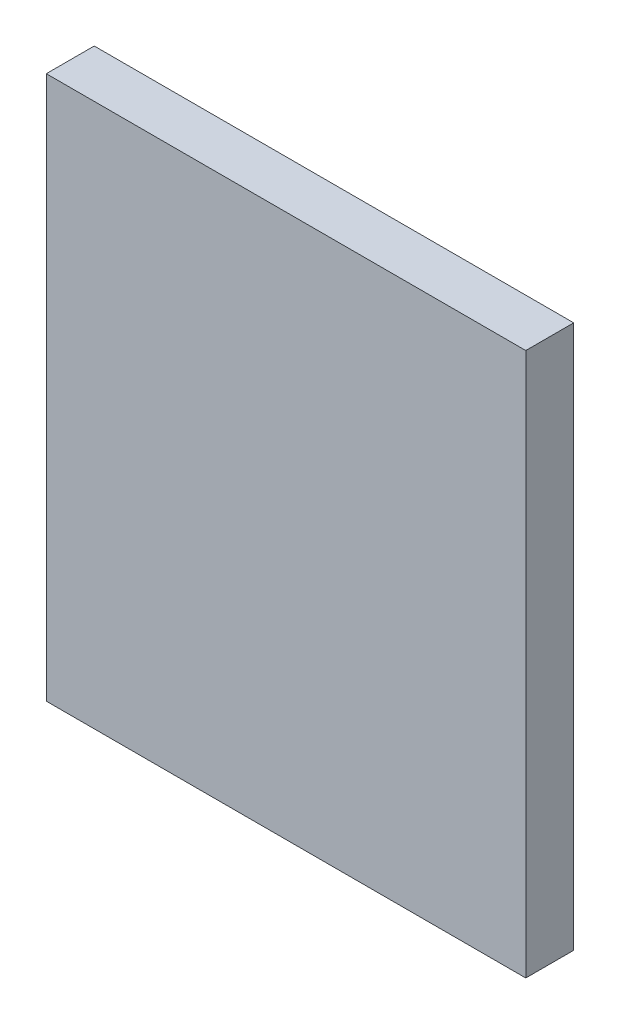
ISO-10303-21;
HEADER;
FILE_DESCRIPTION(('STEP AP214'),'2;1');
FILE_NAME('part.step','',(''),(''),'','','');
FILE_SCHEMA(('AUTOMOTIVE_DESIGN { 1 0 10303 214 1 1 1 1 }'));
ENDSEC;
DATA;
#1=APPLICATION_CONTEXT('core data for automotive mechanical design processes');
#2=APPLICATION_PROTOCOL_DEFINITION('international standard','automotive_design',2000,#1);
#3=PRODUCT_CONTEXT('',#1,'mechanical');
#4=PRODUCT('Part','Part','',(#3));
#5=PRODUCT_RELATED_PRODUCT_CATEGORY('part','',(#4));
#6=PRODUCT_DEFINITION_FORMATION('','',#4);
#7=PRODUCT_DEFINITION_CONTEXT('part definition',#1,'design');
#8=PRODUCT_DEFINITION('design','',#6,#7);
#9=PRODUCT_DEFINITION_SHAPE('','',#8);
#10=(LENGTH_UNIT() NAMED_UNIT(*) SI_UNIT(.MILLI.,.METRE.));
#11=(NAMED_UNIT(*) PLANE_ANGLE_UNIT() SI_UNIT($,.RADIAN.));
#12=(NAMED_UNIT(*) SI_UNIT($,.STERADIAN.) SOLID_ANGLE_UNIT());
#13=UNCERTAINTY_MEASURE_WITH_UNIT(LENGTH_MEASURE(1.E-05),#10,'distance_accuracy_value','');
#14=(GEOMETRIC_REPRESENTATION_CONTEXT(3) GLOBAL_UNCERTAINTY_ASSIGNED_CONTEXT((#13)) GLOBAL_UNIT_ASSIGNED_CONTEXT((#10,
#11,#12)) REPRESENTATION_CONTEXT('',''));
#15=CARTESIAN_POINT('',(0.,0.,0.));
#16=DIRECTION('',(0.,0.,1.));
#17=DIRECTION('',(1.,0.,0.));
#18=AXIS2_PLACEMENT_3D('',#15,#16,#17);
#19=CARTESIAN_POINT('',(75.,85.,15.));
#20=DIRECTION('',(-1.,0.,0.));
#21=DIRECTION('',(0.,-1.,0.));
#22=AXIS2_PLACEMENT_3D('',#19,#20,#21);
#23=PLANE('',#22);
#24=DIRECTION('',(0.,1.,0.));
#25=VECTOR('',#24,1.);
#26=CARTESIAN_POINT('',(75.,85.,0.));
#27=LINE('',#26,#25);
#28=CARTESIAN_POINT('',(75.,-85.,0.));
#29=VERTEX_POINT('',#28);
#30=CARTESIAN_POINT('',(75.,85.,0.));
#31=VERTEX_POINT('',#30);
#32=EDGE_CURVE('E96',#29,#31,#27,.T.);
#33=ORIENTED_EDGE('',*,*,#32,.T.);
#34=DIRECTION('',(0.,0.,-1.));
#35=VECTOR('',#34,1.);
#36=CARTESIAN_POINT('',(75.,85.,15.));
#37=LINE('',#36,#35);
#38=CARTESIAN_POINT('',(75.,85.,15.));
#39=VERTEX_POINT('',#38);
#40=EDGE_CURVE('E11',#39,#31,#37,.T.);
#41=ORIENTED_EDGE('',*,*,#40,.F.);
#42=DIRECTION('',(0.,1.,0.));
#43=VECTOR('',#42,1.);
#44=CARTESIAN_POINT('',(75.,85.,15.));
#45=LINE('',#44,#43);
#46=CARTESIAN_POINT('',(75.,-85.,15.));
#47=VERTEX_POINT('',#46);
#48=EDGE_CURVE('E84',#47,#39,#45,.T.);
#49=ORIENTED_EDGE('',*,*,#48,.F.);
#50=DIRECTION('',(0.,0.,-1.));
#51=VECTOR('',#50,1.);
#52=CARTESIAN_POINT('',(75.,-85.,15.));
#53=LINE('',#52,#51);
#54=EDGE_CURVE('E92',#47,#29,#53,.T.);
#55=ORIENTED_EDGE('',*,*,#54,.T.);
#56=EDGE_LOOP('',(#33,#41,#49,#55));
#57=FACE_BOUND('',#56,.T.);
#58=ADVANCED_FACE('F33',(#57),#23,.F.);
#59=CARTESIAN_POINT('',(-75.,85.,15.));
#60=DIRECTION('',(0.,-1.,0.));
#61=DIRECTION('',(0.,0.,-1.));
#62=AXIS2_PLACEMENT_3D('',#59,#60,#61);
#63=PLANE('',#62);
#64=DIRECTION('',(-1.,0.,0.));
#65=VECTOR('',#64,1.);
#66=CARTESIAN_POINT('',(-75.,85.,0.));
#67=LINE('',#66,#65);
#68=CARTESIAN_POINT('',(-75.,85.,0.));
#69=VERTEX_POINT('',#68);
#70=EDGE_CURVE('E88',#31,#69,#67,.T.);
#71=ORIENTED_EDGE('',*,*,#70,.T.);
#72=DIRECTION('',(0.,0.,-1.));
#73=VECTOR('',#72,1.);
#74=CARTESIAN_POINT('',(-75.,85.,15.));
#75=LINE('',#74,#73);
#76=CARTESIAN_POINT('',(-75.,85.,15.));
#77=VERTEX_POINT('',#76);
#78=EDGE_CURVE('E41',#77,#69,#75,.T.);
#79=ORIENTED_EDGE('',*,*,#78,.F.);
#80=DIRECTION('',(-1.,0.,0.));
#81=VECTOR('',#80,1.);
#82=CARTESIAN_POINT('',(-75.,85.,15.));
#83=LINE('',#82,#81);
#84=EDGE_CURVE('E79',#39,#77,#83,.T.);
#85=ORIENTED_EDGE('',*,*,#84,.F.);
#86=ORIENTED_EDGE('',*,*,#40,.T.);
#87=EDGE_LOOP('',(#71,#79,#85,#86));
#88=FACE_BOUND('',#87,.T.);
#89=ADVANCED_FACE('F87',(#88),#63,.F.);
#90=CARTESIAN_POINT('',(-75.,85.,15.));
#91=DIRECTION('',(1.,0.,0.));
#92=DIRECTION('',(0.,1.,0.));
#93=AXIS2_PLACEMENT_3D('',#90,#91,#92);
#94=PLANE('',#93);
#95=DIRECTION('',(0.,-1.,0.));
#96=VECTOR('',#95,1.);
#97=CARTESIAN_POINT('',(-75.,85.,0.));
#98=LINE('',#97,#96);
#99=CARTESIAN_POINT('',(-75.,-85.,0.));
#100=VERTEX_POINT('',#99);
#101=EDGE_CURVE('E66',#69,#100,#98,.T.);
#102=ORIENTED_EDGE('',*,*,#101,.T.);
#103=DIRECTION('',(0.,0.,-1.));
#104=VECTOR('',#103,1.);
#105=CARTESIAN_POINT('',(-75.,-85.,15.));
#106=LINE('',#105,#104);
#107=CARTESIAN_POINT('',(-75.,-85.,15.));
#108=VERTEX_POINT('',#107);
#109=EDGE_CURVE('E89',#108,#100,#106,.T.);
#110=ORIENTED_EDGE('',*,*,#109,.F.);
#111=DIRECTION('',(0.,-1.,0.));
#112=VECTOR('',#111,1.);
#113=CARTESIAN_POINT('',(-75.,85.,15.));
#114=LINE('',#113,#112);
#115=EDGE_CURVE('E82',#77,#108,#114,.T.);
#116=ORIENTED_EDGE('',*,*,#115,.F.);
#117=ORIENTED_EDGE('',*,*,#78,.T.);
#118=EDGE_LOOP('',(#102,#110,#116,#117));
#119=FACE_BOUND('',#118,.T.);
#120=ADVANCED_FACE('F90',(#119),#94,.F.);
#121=CARTESIAN_POINT('',(-75.,-85.,15.));
#122=DIRECTION('',(0.,1.,0.));
#123=DIRECTION('',(0.,0.,1.));
#124=AXIS2_PLACEMENT_3D('',#121,#122,#123);
#125=PLANE('',#124);
#126=DIRECTION('',(1.,0.,0.));
#127=VECTOR('',#126,1.);
#128=CARTESIAN_POINT('',(-75.,-85.,0.));
#129=LINE('',#128,#127);
#130=EDGE_CURVE('E72',#100,#29,#129,.T.);
#131=ORIENTED_EDGE('',*,*,#130,.T.);
#132=ORIENTED_EDGE('',*,*,#54,.F.);
#133=DIRECTION('',(1.,0.,0.));
#134=VECTOR('',#133,1.);
#135=CARTESIAN_POINT('',(-75.,-85.,15.));
#136=LINE('',#135,#134);
#137=EDGE_CURVE('E49',#108,#47,#136,.T.);
#138=ORIENTED_EDGE('',*,*,#137,.F.);
#139=ORIENTED_EDGE('',*,*,#109,.T.);
#140=EDGE_LOOP('',(#131,#132,#138,#139));
#141=FACE_BOUND('',#140,.T.);
#142=ADVANCED_FACE('F103',(#141),#125,.F.);
#143=CARTESIAN_POINT('',(0.,0.,15.));
#144=DIRECTION('',(0.,0.,1.));
#145=DIRECTION('',(1.,0.,0.));
#146=AXIS2_PLACEMENT_3D('',#143,#144,#145);
#147=PLANE('',#146);
#148=ORIENTED_EDGE('',*,*,#48,.T.);
#149=ORIENTED_EDGE('',*,*,#84,.T.);
#150=ORIENTED_EDGE('',*,*,#115,.T.);
#151=ORIENTED_EDGE('',*,*,#137,.T.);
#152=EDGE_LOOP('',(#148,#149,#150,#151));
#153=FACE_BOUND('',#152,.T.);
#154=ADVANCED_FACE('F80',(#153),#147,.T.);
#155=CARTESIAN_POINT('',(0.,0.,0.));
#156=DIRECTION('',(0.,0.,1.));
#157=DIRECTION('',(1.,0.,0.));
#158=AXIS2_PLACEMENT_3D('',#155,#156,#157);
#159=PLANE('',#158);
#160=ORIENTED_EDGE('',*,*,#32,.F.);
#161=ORIENTED_EDGE('',*,*,#130,.F.);
#162=ORIENTED_EDGE('',*,*,#101,.F.);
#163=ORIENTED_EDGE('',*,*,#70,.F.);
#164=EDGE_LOOP('',(#160,#161,#162,#163));
#165=FACE_BOUND('',#164,.T.);
#166=ADVANCED_FACE('F106',(#165),#159,.F.);
#167=CLOSED_SHELL('',(#58,#89,#120,#142,#154,#166));
#168=MANIFOLD_SOLID_BREP('B2',#167);
#169=ADVANCED_BREP_SHAPE_REPRESENTATION('',(#18,#168),#14);
#170=SHAPE_DEFINITION_REPRESENTATION(#9,#169);
ENDSEC;
END-ISO-10303-21;
